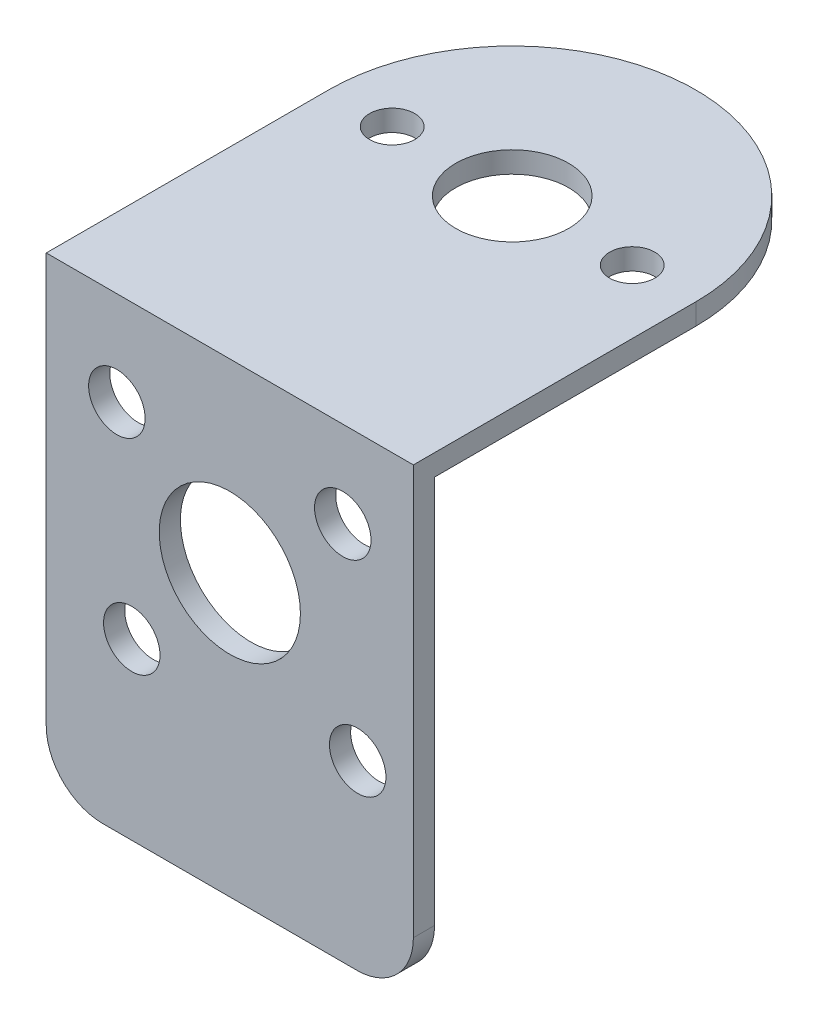
ISO-10303-21;
HEADER;
FILE_DESCRIPTION(('STEP AP214'),'2;1');
FILE_NAME('part.step','',(''),(''),'','','');
FILE_SCHEMA(('AUTOMOTIVE_DESIGN { 1 0 10303 214 1 1 1 1 }'));
ENDSEC;
DATA;
#1=APPLICATION_CONTEXT('core data for automotive mechanical design processes');
#2=APPLICATION_PROTOCOL_DEFINITION('international standard','automotive_design',2000,#1);
#3=PRODUCT_CONTEXT('',#1,'mechanical');
#4=PRODUCT('Part','Part','',(#3));
#5=PRODUCT_RELATED_PRODUCT_CATEGORY('part','',(#4));
#6=PRODUCT_DEFINITION_FORMATION('','',#4);
#7=PRODUCT_DEFINITION_CONTEXT('part definition',#1,'design');
#8=PRODUCT_DEFINITION('design','',#6,#7);
#9=PRODUCT_DEFINITION_SHAPE('','',#8);
#10=(LENGTH_UNIT() NAMED_UNIT(*) SI_UNIT(.MILLI.,.METRE.));
#11=(NAMED_UNIT(*) PLANE_ANGLE_UNIT() SI_UNIT($,.RADIAN.));
#12=(NAMED_UNIT(*) SI_UNIT($,.STERADIAN.) SOLID_ANGLE_UNIT());
#13=UNCERTAINTY_MEASURE_WITH_UNIT(LENGTH_MEASURE(1.E-05),#10,'distance_accuracy_value','');
#14=(GEOMETRIC_REPRESENTATION_CONTEXT(3) GLOBAL_UNCERTAINTY_ASSIGNED_CONTEXT((#13)) GLOBAL_UNIT_ASSIGNED_CONTEXT((#10,
#11,#12)) REPRESENTATION_CONTEXT('',''));
#15=CARTESIAN_POINT('',(0.,0.,0.));
#16=DIRECTION('',(0.,0.,1.));
#17=DIRECTION('',(1.,0.,0.));
#18=AXIS2_PLACEMENT_3D('',#15,#16,#17);
#19=CARTESIAN_POINT('',(-13.,-1.5,20.));
#20=DIRECTION('',(0.,0.,1.));
#21=DIRECTION('',(1.,0.,0.));
#22=AXIS2_PLACEMENT_3D('',#19,#20,#21);
#23=PLANE('',#22);
#24=DIRECTION('',(1.,0.,0.));
#25=VECTOR('',#24,1.);
#26=CARTESIAN_POINT('',(-13.,0.,20.));
#27=LINE('',#26,#25);
#28=CARTESIAN_POINT('',(-13.,0.,20.));
#29=VERTEX_POINT('',#28);
#30=CARTESIAN_POINT('',(13.,0.,20.));
#31=VERTEX_POINT('',#30);
#32=EDGE_CURVE('E87',#29,#31,#27,.T.);
#33=ORIENTED_EDGE('',*,*,#32,.F.);
#34=DIRECTION('',(0.,1.,0.));
#35=VECTOR('',#34,1.);
#36=CARTESIAN_POINT('',(-13.,-1.5,20.));
#37=LINE('',#36,#35);
#38=CARTESIAN_POINT('',(-13.,-29.,20.));
#39=VERTEX_POINT('',#38);
#40=EDGE_CURVE('E11',#39,#29,#37,.T.);
#41=ORIENTED_EDGE('',*,*,#40,.F.);
#42=CARTESIAN_POINT('',(-9.,-29.,20.));
#43=DIRECTION('',(0.,0.,1.));
#44=DIRECTION('',(1.,0.,0.));
#45=AXIS2_PLACEMENT_3D('',#42,#43,#44);
#46=CIRCLE('',#45,4.);
#47=CARTESIAN_POINT('',(-8.99999999999997,-33.,20.));
#48=VERTEX_POINT('',#47);
#49=EDGE_CURVE('E142',#39,#48,#46,.T.);
#50=ORIENTED_EDGE('',*,*,#49,.T.);
#51=DIRECTION('',(1.,0.,0.));
#52=VECTOR('',#51,1.);
#53=CARTESIAN_POINT('',(-8.99999999999997,-33.,20.));
#54=LINE('',#53,#52);
#55=CARTESIAN_POINT('',(8.99999999999997,-33.,20.));
#56=VERTEX_POINT('',#55);
#57=EDGE_CURVE('E138',#48,#56,#54,.T.);
#58=ORIENTED_EDGE('',*,*,#57,.T.);
#59=CARTESIAN_POINT('',(9.00000000000001,-29.,20.));
#60=DIRECTION('',(0.,0.,1.));
#61=DIRECTION('',(-1.,0.,0.));
#62=AXIS2_PLACEMENT_3D('',#59,#60,#61);
#63=CIRCLE('',#62,4.);
#64=CARTESIAN_POINT('',(13.,-29.,20.));
#65=VERTEX_POINT('',#64);
#66=EDGE_CURVE('E129',#56,#65,#63,.T.);
#67=ORIENTED_EDGE('',*,*,#66,.T.);
#68=DIRECTION('',(0.,1.,0.));
#69=VECTOR('',#68,1.);
#70=CARTESIAN_POINT('',(13.,-1.5,20.));
#71=LINE('',#70,#69);
#72=EDGE_CURVE('E38',#65,#31,#71,.T.);
#73=ORIENTED_EDGE('',*,*,#72,.T.);
#74=EDGE_LOOP('',(#33,#41,#50,#58,#67,#73));
#75=FACE_BOUND('',#74,.T.);
#76=CARTESIAN_POINT('',(9.05732469873245,-20.1222303547735,20.));
#77=DIRECTION('',(0.,0.,1.));
#78=DIRECTION('',(1.,0.,0.));
#79=AXIS2_PLACEMENT_3D('',#76,#77,#78);
#80=CIRCLE('',#79,2.);
#81=CARTESIAN_POINT('',(11.0573246987324,-20.1222303547735,20.));
#82=VERTEX_POINT('',#81);
#83=EDGE_CURVE('E371',#82,#82,#80,.T.);
#84=ORIENTED_EDGE('',*,*,#83,.F.);
#85=EDGE_LOOP('',(#84));
#86=FACE_BOUND('',#85,.T.);
#87=CARTESIAN_POINT('',(-6.94267530126755,-20.6476318564629,20.));
#88=DIRECTION('',(0.,0.,1.));
#89=DIRECTION('',(1.,0.,0.));
#90=AXIS2_PLACEMENT_3D('',#87,#88,#89);
#91=CIRCLE('',#90,2.);
#92=CARTESIAN_POINT('',(-4.94267530126755,-20.6476318564629,20.));
#93=VERTEX_POINT('',#92);
#94=EDGE_CURVE('E365',#93,#93,#91,.T.);
#95=ORIENTED_EDGE('',*,*,#94,.F.);
#96=EDGE_LOOP('',(#95));
#97=FACE_BOUND('',#96,.T.);
#98=CARTESIAN_POINT('',(-8.,-6.64763185646285,20.));
#99=DIRECTION('',(0.,0.,1.));
#100=DIRECTION('',(1.,0.,0.));
#101=AXIS2_PLACEMENT_3D('',#98,#99,#100);
#102=CIRCLE('',#101,2.);
#103=CARTESIAN_POINT('',(-6.,-6.64763185646285,20.));
#104=VERTEX_POINT('',#103);
#105=EDGE_CURVE('E359',#104,#104,#102,.T.);
#106=ORIENTED_EDGE('',*,*,#105,.F.);
#107=EDGE_LOOP('',(#106));
#108=FACE_BOUND('',#107,.T.);
#109=CARTESIAN_POINT('',(8.,-6.1222303547735,20.));
#110=DIRECTION('',(0.,0.,1.));
#111=DIRECTION('',(1.,0.,0.));
#112=AXIS2_PLACEMENT_3D('',#109,#110,#111);
#113=CIRCLE('',#112,2.);
#114=CARTESIAN_POINT('',(10.,-6.1222303547735,20.));
#115=VERTEX_POINT('',#114);
#116=EDGE_CURVE('E337',#115,#115,#113,.T.);
#117=ORIENTED_EDGE('',*,*,#116,.F.);
#118=EDGE_LOOP('',(#117));
#119=FACE_BOUND('',#118,.T.);
#120=CARTESIAN_POINT('',(0.,-13.1222303547735,20.));
#121=DIRECTION('',(0.,0.,1.));
#122=DIRECTION('',(1.,0.,0.));
#123=AXIS2_PLACEMENT_3D('',#120,#121,#122);
#124=CIRCLE('',#123,5.);
#125=CARTESIAN_POINT('',(5.,-13.1222303547735,20.));
#126=VERTEX_POINT('',#125);
#127=EDGE_CURVE('E329',#126,#126,#124,.T.);
#128=ORIENTED_EDGE('',*,*,#127,.F.);
#129=EDGE_LOOP('',(#128));
#130=FACE_BOUND('',#129,.T.);
#131=ADVANCED_FACE('F35',(#75,#86,#97,#108,#119,#130),#23,.T.);
#132=CARTESIAN_POINT('',(-13.,-1.5,20.));
#133=DIRECTION('',(-1.,0.,0.));
#134=DIRECTION('',(0.,0.,1.));
#135=AXIS2_PLACEMENT_3D('',#132,#133,#134);
#136=PLANE('',#135);
#137=DIRECTION('',(0.,0.,1.));
#138=VECTOR('',#137,1.);
#139=CARTESIAN_POINT('',(-13.,0.,20.));
#140=LINE('',#139,#138);
#141=CARTESIAN_POINT('',(-13.,0.,0.));
#142=VERTEX_POINT('',#141);
#143=EDGE_CURVE('E79',#142,#29,#140,.T.);
#144=ORIENTED_EDGE('',*,*,#143,.F.);
#145=DIRECTION('',(0.,1.,0.));
#146=VECTOR('',#145,1.);
#147=CARTESIAN_POINT('',(-13.,-1.5,0.));
#148=LINE('',#147,#146);
#149=CARTESIAN_POINT('',(-13.,-1.5,0.));
#150=VERTEX_POINT('',#149);
#151=EDGE_CURVE('E43',#150,#142,#148,.T.);
#152=ORIENTED_EDGE('',*,*,#151,.F.);
#153=DIRECTION('',(0.,0.,1.));
#154=VECTOR('',#153,1.);
#155=CARTESIAN_POINT('',(-13.,-1.5,20.));
#156=LINE('',#155,#154);
#157=CARTESIAN_POINT('',(-13.,-1.5,18.5));
#158=VERTEX_POINT('',#157);
#159=EDGE_CURVE('E111',#150,#158,#156,.T.);
#160=ORIENTED_EDGE('',*,*,#159,.T.);
#161=DIRECTION('',(0.,-1.,0.));
#162=VECTOR('',#161,1.);
#163=CARTESIAN_POINT('',(-13.,-1.5,18.5));
#164=LINE('',#163,#162);
#165=CARTESIAN_POINT('',(-13.,-29.,18.5));
#166=VERTEX_POINT('',#165);
#167=EDGE_CURVE('E51',#158,#166,#164,.T.);
#168=ORIENTED_EDGE('',*,*,#167,.T.);
#169=DIRECTION('',(0.,0.,1.));
#170=VECTOR('',#169,1.);
#171=CARTESIAN_POINT('',(-13.,-29.,18.5));
#172=LINE('',#171,#170);
#173=EDGE_CURVE('E82',#166,#39,#172,.T.);
#174=ORIENTED_EDGE('',*,*,#173,.T.);
#175=ORIENTED_EDGE('',*,*,#40,.T.);
#176=EDGE_LOOP('',(#144,#152,#160,#168,#174,#175));
#177=FACE_BOUND('',#176,.T.);
#178=ADVANCED_FACE('F77',(#177),#136,.T.);
#179=CARTESIAN_POINT('',(0.,-1.5,0.));
#180=DIRECTION('',(0.,1.,0.));
#181=DIRECTION('',(0.,0.,1.));
#182=AXIS2_PLACEMENT_3D('',#179,#180,#181);
#183=CYLINDRICAL_SURFACE('',#182,13.);
#184=CARTESIAN_POINT('',(0.,0.,0.));
#185=DIRECTION('',(0.,1.,0.));
#186=DIRECTION('',(0.,0.,1.));
#187=AXIS2_PLACEMENT_3D('',#184,#185,#186);
#188=CIRCLE('',#187,13.);
#189=CARTESIAN_POINT('',(13.,0.,0.));
#190=VERTEX_POINT('',#189);
#191=EDGE_CURVE('E100',#190,#142,#188,.T.);
#192=ORIENTED_EDGE('',*,*,#191,.F.);
#193=DIRECTION('',(0.,1.,0.));
#194=VECTOR('',#193,1.);
#195=CARTESIAN_POINT('',(13.,-1.5,0.));
#196=LINE('',#195,#194);
#197=CARTESIAN_POINT('',(13.,-1.5,0.));
#198=VERTEX_POINT('',#197);
#199=EDGE_CURVE('E108',#198,#190,#196,.T.);
#200=ORIENTED_EDGE('',*,*,#199,.F.);
#201=CARTESIAN_POINT('',(0.,-1.5,0.));
#202=DIRECTION('',(0.,1.,0.));
#203=DIRECTION('',(0.,0.,1.));
#204=AXIS2_PLACEMENT_3D('',#201,#202,#203);
#205=CIRCLE('',#204,13.);
#206=EDGE_CURVE('E103',#198,#150,#205,.T.);
#207=ORIENTED_EDGE('',*,*,#206,.T.);
#208=ORIENTED_EDGE('',*,*,#151,.T.);
#209=EDGE_LOOP('',(#192,#200,#207,#208));
#210=FACE_BOUND('',#209,.T.);
#211=ADVANCED_FACE('F192',(#210),#183,.T.);
#212=CARTESIAN_POINT('',(13.,-1.5,20.));
#213=DIRECTION('',(1.,0.,0.));
#214=DIRECTION('',(0.,0.,-1.));
#215=AXIS2_PLACEMENT_3D('',#212,#213,#214);
#216=PLANE('',#215);
#217=DIRECTION('',(0.,0.,-1.));
#218=VECTOR('',#217,1.);
#219=CARTESIAN_POINT('',(13.,0.,20.));
#220=LINE('',#219,#218);
#221=EDGE_CURVE('E94',#31,#190,#220,.T.);
#222=ORIENTED_EDGE('',*,*,#221,.F.);
#223=ORIENTED_EDGE('',*,*,#72,.F.);
#224=DIRECTION('',(0.,0.,1.));
#225=VECTOR('',#224,1.);
#226=CARTESIAN_POINT('',(13.,-29.,18.5));
#227=LINE('',#226,#225);
#228=CARTESIAN_POINT('',(13.,-29.,18.5));
#229=VERTEX_POINT('',#228);
#230=EDGE_CURVE('E121',#229,#65,#227,.T.);
#231=ORIENTED_EDGE('',*,*,#230,.F.);
#232=DIRECTION('',(0.,1.,0.));
#233=VECTOR('',#232,1.);
#234=CARTESIAN_POINT('',(13.,-1.5,18.5));
#235=LINE('',#234,#233);
#236=CARTESIAN_POINT('',(13.,-1.5,18.5));
#237=VERTEX_POINT('',#236);
#238=EDGE_CURVE('E152',#229,#237,#235,.T.);
#239=ORIENTED_EDGE('',*,*,#238,.T.);
#240=DIRECTION('',(0.,0.,-1.));
#241=VECTOR('',#240,1.);
#242=CARTESIAN_POINT('',(13.,-1.5,20.));
#243=LINE('',#242,#241);
#244=EDGE_CURVE('E101',#237,#198,#243,.T.);
#245=ORIENTED_EDGE('',*,*,#244,.T.);
#246=ORIENTED_EDGE('',*,*,#199,.T.);
#247=EDGE_LOOP('',(#222,#223,#231,#239,#245,#246));
#248=FACE_BOUND('',#247,.T.);
#249=ADVANCED_FACE('F115',(#248),#216,.T.);
#250=CARTESIAN_POINT('',(0.,-1.5,0.));
#251=DIRECTION('',(0.,1.,0.));
#252=DIRECTION('',(0.,0.,1.));
#253=AXIS2_PLACEMENT_3D('',#250,#251,#252);
#254=PLANE('',#253);
#255=CARTESIAN_POINT('',(-8.5,-1.5,0.));
#256=DIRECTION('',(0.,1.,0.));
#257=DIRECTION('',(0.,0.,1.));
#258=AXIS2_PLACEMENT_3D('',#255,#256,#257);
#259=CIRCLE('',#258,1.6);
#260=CARTESIAN_POINT('',(-8.5,-1.5,1.6));
#261=VERTEX_POINT('',#260);
#262=EDGE_CURVE('E153',#261,#261,#259,.T.);
#263=ORIENTED_EDGE('',*,*,#262,.T.);
#264=EDGE_LOOP('',(#263));
#265=FACE_BOUND('',#264,.T.);
#266=CARTESIAN_POINT('',(8.5,-1.5,0.));
#267=DIRECTION('',(0.,1.,0.));
#268=DIRECTION('',(0.,0.,1.));
#269=AXIS2_PLACEMENT_3D('',#266,#267,#268);
#270=CIRCLE('',#269,1.6);
#271=CARTESIAN_POINT('',(8.5,-1.5,1.6));
#272=VERTEX_POINT('',#271);
#273=EDGE_CURVE('E159',#272,#272,#270,.T.);
#274=ORIENTED_EDGE('',*,*,#273,.T.);
#275=EDGE_LOOP('',(#274));
#276=FACE_BOUND('',#275,.T.);
#277=CARTESIAN_POINT('',(0.,-1.5,0.));
#278=DIRECTION('',(0.,1.,0.));
#279=DIRECTION('',(0.,0.,1.));
#280=AXIS2_PLACEMENT_3D('',#277,#278,#279);
#281=CIRCLE('',#280,4.);
#282=CARTESIAN_POINT('',(0.,-1.5,4.));
#283=VERTEX_POINT('',#282);
#284=EDGE_CURVE('E95',#283,#283,#281,.T.);
#285=ORIENTED_EDGE('',*,*,#284,.T.);
#286=EDGE_LOOP('',(#285));
#287=FACE_BOUND('',#286,.T.);
#288=ORIENTED_EDGE('',*,*,#244,.F.);
#289=DIRECTION('',(-1.,0.,0.));
#290=VECTOR('',#289,1.);
#291=CARTESIAN_POINT('',(-13.,-1.5,18.5));
#292=LINE('',#291,#290);
#293=EDGE_CURVE('E139',#237,#158,#292,.T.);
#294=ORIENTED_EDGE('',*,*,#293,.T.);
#295=ORIENTED_EDGE('',*,*,#159,.F.);
#296=ORIENTED_EDGE('',*,*,#206,.F.);
#297=EDGE_LOOP('',(#288,#294,#295,#296));
#298=FACE_BOUND('',#297,.T.);
#299=ADVANCED_FACE('F173',(#265,#276,#287,#298),#254,.F.);
#300=CARTESIAN_POINT('',(0.,0.,0.));
#301=DIRECTION('',(0.,1.,0.));
#302=DIRECTION('',(0.,0.,1.));
#303=AXIS2_PLACEMENT_3D('',#300,#301,#302);
#304=PLANE('',#303);
#305=CARTESIAN_POINT('',(-8.5,0.,0.));
#306=DIRECTION('',(0.,1.,0.));
#307=DIRECTION('',(0.,0.,1.));
#308=AXIS2_PLACEMENT_3D('',#305,#306,#307);
#309=CIRCLE('',#308,1.6);
#310=CARTESIAN_POINT('',(-8.5,0.,1.6));
#311=VERTEX_POINT('',#310);
#312=EDGE_CURVE('E134',#311,#311,#309,.T.);
#313=ORIENTED_EDGE('',*,*,#312,.F.);
#314=EDGE_LOOP('',(#313));
#315=FACE_BOUND('',#314,.T.);
#316=CARTESIAN_POINT('',(8.5,0.,0.));
#317=DIRECTION('',(0.,1.,0.));
#318=DIRECTION('',(0.,0.,1.));
#319=AXIS2_PLACEMENT_3D('',#316,#317,#318);
#320=CIRCLE('',#319,1.6);
#321=CARTESIAN_POINT('',(8.5,0.,1.6));
#322=VERTEX_POINT('',#321);
#323=EDGE_CURVE('E156',#322,#322,#320,.T.);
#324=ORIENTED_EDGE('',*,*,#323,.F.);
#325=EDGE_LOOP('',(#324));
#326=FACE_BOUND('',#325,.T.);
#327=CARTESIAN_POINT('',(0.,0.,0.));
#328=DIRECTION('',(0.,1.,0.));
#329=DIRECTION('',(0.,0.,1.));
#330=AXIS2_PLACEMENT_3D('',#327,#328,#329);
#331=CIRCLE('',#330,4.);
#332=CARTESIAN_POINT('',(0.,0.,4.));
#333=VERTEX_POINT('',#332);
#334=EDGE_CURVE('E162',#333,#333,#331,.T.);
#335=ORIENTED_EDGE('',*,*,#334,.F.);
#336=EDGE_LOOP('',(#335));
#337=FACE_BOUND('',#336,.T.);
#338=ORIENTED_EDGE('',*,*,#32,.T.);
#339=ORIENTED_EDGE('',*,*,#221,.T.);
#340=ORIENTED_EDGE('',*,*,#191,.T.);
#341=ORIENTED_EDGE('',*,*,#143,.T.);
#342=EDGE_LOOP('',(#338,#339,#340,#341));
#343=FACE_BOUND('',#342,.T.);
#344=ADVANCED_FACE('F98',(#315,#326,#337,#343),#304,.T.);
#345=CARTESIAN_POINT('',(0.,-1.5,0.));
#346=DIRECTION('',(0.,1.,0.));
#347=DIRECTION('',(0.,0.,1.));
#348=AXIS2_PLACEMENT_3D('',#345,#346,#347);
#349=CYLINDRICAL_SURFACE('',#348,4.);
#350=ORIENTED_EDGE('',*,*,#284,.F.);
#351=EDGE_LOOP('',(#350));
#352=FACE_BOUND('',#351,.T.);
#353=ORIENTED_EDGE('',*,*,#334,.T.);
#354=EDGE_LOOP('',(#353));
#355=FACE_BOUND('',#354,.T.);
#356=ADVANCED_FACE('F170',(#352,#355),#349,.F.);
#357=CARTESIAN_POINT('',(8.5,-1.5,0.));
#358=DIRECTION('',(0.,1.,0.));
#359=DIRECTION('',(0.,0.,1.));
#360=AXIS2_PLACEMENT_3D('',#357,#358,#359);
#361=CYLINDRICAL_SURFACE('',#360,1.6);
#362=ORIENTED_EDGE('',*,*,#273,.F.);
#363=EDGE_LOOP('',(#362));
#364=FACE_BOUND('',#363,.T.);
#365=ORIENTED_EDGE('',*,*,#323,.T.);
#366=EDGE_LOOP('',(#365));
#367=FACE_BOUND('',#366,.T.);
#368=ADVANCED_FACE('F180',(#364,#367),#361,.F.);
#369=CARTESIAN_POINT('',(-8.5,-1.5,0.));
#370=DIRECTION('',(0.,1.,0.));
#371=DIRECTION('',(0.,0.,1.));
#372=AXIS2_PLACEMENT_3D('',#369,#370,#371);
#373=CYLINDRICAL_SURFACE('',#372,1.6);
#374=ORIENTED_EDGE('',*,*,#262,.F.);
#375=EDGE_LOOP('',(#374));
#376=FACE_BOUND('',#375,.T.);
#377=ORIENTED_EDGE('',*,*,#312,.T.);
#378=EDGE_LOOP('',(#377));
#379=FACE_BOUND('',#378,.T.);
#380=ADVANCED_FACE('F219',(#376,#379),#373,.F.);
#381=CARTESIAN_POINT('',(9.00000000000001,-29.,18.5));
#382=DIRECTION('',(0.,0.,1.));
#383=DIRECTION('',(1.,0.,0.));
#384=AXIS2_PLACEMENT_3D('',#381,#382,#383);
#385=CYLINDRICAL_SURFACE('',#384,4.);
#386=ORIENTED_EDGE('',*,*,#66,.F.);
#387=DIRECTION('',(0.,0.,1.));
#388=VECTOR('',#387,1.);
#389=CARTESIAN_POINT('',(8.99999999999997,-33.,18.5));
#390=LINE('',#389,#388);
#391=CARTESIAN_POINT('',(8.99999999999997,-33.,18.5));
#392=VERTEX_POINT('',#391);
#393=EDGE_CURVE('E135',#392,#56,#390,.T.);
#394=ORIENTED_EDGE('',*,*,#393,.F.);
#395=CARTESIAN_POINT('',(9.00000000000001,-29.,18.5));
#396=DIRECTION('',(0.,0.,1.));
#397=DIRECTION('',(-1.,0.,0.));
#398=AXIS2_PLACEMENT_3D('',#395,#396,#397);
#399=CIRCLE('',#398,4.);
#400=EDGE_CURVE('E132',#392,#229,#399,.T.);
#401=ORIENTED_EDGE('',*,*,#400,.T.);
#402=ORIENTED_EDGE('',*,*,#230,.T.);
#403=EDGE_LOOP('',(#386,#394,#401,#402));
#404=FACE_BOUND('',#403,.T.);
#405=ADVANCED_FACE('F127',(#404),#385,.T.);
#406=CARTESIAN_POINT('',(-8.99999999999997,-33.,18.5));
#407=DIRECTION('',(0.,-1.,0.));
#408=DIRECTION('',(0.,0.,-1.));
#409=AXIS2_PLACEMENT_3D('',#406,#407,#408);
#410=PLANE('',#409);
#411=ORIENTED_EDGE('',*,*,#57,.F.);
#412=DIRECTION('',(0.,0.,1.));
#413=VECTOR('',#412,1.);
#414=CARTESIAN_POINT('',(-8.99999999999997,-33.,18.5));
#415=LINE('',#414,#413);
#416=CARTESIAN_POINT('',(-8.99999999999997,-33.,18.5));
#417=VERTEX_POINT('',#416);
#418=EDGE_CURVE('E148',#417,#48,#415,.T.);
#419=ORIENTED_EDGE('',*,*,#418,.F.);
#420=DIRECTION('',(1.,0.,0.));
#421=VECTOR('',#420,1.);
#422=CARTESIAN_POINT('',(-8.99999999999997,-33.,18.5));
#423=LINE('',#422,#421);
#424=EDGE_CURVE('E323',#417,#392,#423,.T.);
#425=ORIENTED_EDGE('',*,*,#424,.T.);
#426=ORIENTED_EDGE('',*,*,#393,.T.);
#427=EDGE_LOOP('',(#411,#419,#425,#426));
#428=FACE_BOUND('',#427,.T.);
#429=ADVANCED_FACE('F218',(#428),#410,.T.);
#430=CARTESIAN_POINT('',(-9.,-29.,18.5));
#431=DIRECTION('',(0.,0.,1.));
#432=DIRECTION('',(1.,0.,0.));
#433=AXIS2_PLACEMENT_3D('',#430,#431,#432);
#434=CYLINDRICAL_SURFACE('',#433,4.);
#435=ORIENTED_EDGE('',*,*,#49,.F.);
#436=ORIENTED_EDGE('',*,*,#173,.F.);
#437=CARTESIAN_POINT('',(-9.,-29.,18.5));
#438=DIRECTION('',(0.,0.,1.));
#439=DIRECTION('',(1.,0.,0.));
#440=AXIS2_PLACEMENT_3D('',#437,#438,#439);
#441=CIRCLE('',#440,4.);
#442=EDGE_CURVE('E341',#166,#417,#441,.T.);
#443=ORIENTED_EDGE('',*,*,#442,.T.);
#444=ORIENTED_EDGE('',*,*,#418,.T.);
#445=EDGE_LOOP('',(#435,#436,#443,#444));
#446=FACE_BOUND('',#445,.T.);
#447=ADVANCED_FACE('F229',(#446),#434,.T.);
#448=CARTESIAN_POINT('',(9.00000000000001,-29.,18.5));
#449=DIRECTION('',(0.,0.,-1.));
#450=DIRECTION('',(-1.,0.,0.));
#451=AXIS2_PLACEMENT_3D('',#448,#449,#450);
#452=PLANE('',#451);
#453=CARTESIAN_POINT('',(9.05732469873245,-20.1222303547735,18.5));
#454=DIRECTION('',(0.,0.,1.));
#455=DIRECTION('',(1.,0.,0.));
#456=AXIS2_PLACEMENT_3D('',#453,#454,#455);
#457=CIRCLE('',#456,2.);
#458=CARTESIAN_POINT('',(11.0573246987324,-20.1222303547735,18.5));
#459=VERTEX_POINT('',#458);
#460=EDGE_CURVE('E368',#459,#459,#457,.T.);
#461=ORIENTED_EDGE('',*,*,#460,.T.);
#462=EDGE_LOOP('',(#461));
#463=FACE_BOUND('',#462,.T.);
#464=CARTESIAN_POINT('',(-6.94267530126755,-20.6476318564629,18.5));
#465=DIRECTION('',(0.,0.,1.));
#466=DIRECTION('',(1.,0.,0.));
#467=AXIS2_PLACEMENT_3D('',#464,#465,#466);
#468=CIRCLE('',#467,2.);
#469=CARTESIAN_POINT('',(-4.94267530126755,-20.6476318564629,18.5));
#470=VERTEX_POINT('',#469);
#471=EDGE_CURVE('E362',#470,#470,#468,.T.);
#472=ORIENTED_EDGE('',*,*,#471,.T.);
#473=EDGE_LOOP('',(#472));
#474=FACE_BOUND('',#473,.T.);
#475=CARTESIAN_POINT('',(-8.,-6.64763185646285,18.5));
#476=DIRECTION('',(0.,0.,1.));
#477=DIRECTION('',(1.,0.,0.));
#478=AXIS2_PLACEMENT_3D('',#475,#476,#477);
#479=CIRCLE('',#478,2.);
#480=CARTESIAN_POINT('',(-6.,-6.64763185646285,18.5));
#481=VERTEX_POINT('',#480);
#482=EDGE_CURVE('E356',#481,#481,#479,.T.);
#483=ORIENTED_EDGE('',*,*,#482,.T.);
#484=EDGE_LOOP('',(#483));
#485=FACE_BOUND('',#484,.T.);
#486=CARTESIAN_POINT('',(8.,-6.1222303547735,18.5));
#487=DIRECTION('',(0.,0.,1.));
#488=DIRECTION('',(1.,0.,0.));
#489=AXIS2_PLACEMENT_3D('',#486,#487,#488);
#490=CIRCLE('',#489,2.);
#491=CARTESIAN_POINT('',(10.,-6.1222303547735,18.5));
#492=VERTEX_POINT('',#491);
#493=EDGE_CURVE('E334',#492,#492,#490,.T.);
#494=ORIENTED_EDGE('',*,*,#493,.T.);
#495=EDGE_LOOP('',(#494));
#496=FACE_BOUND('',#495,.T.);
#497=CARTESIAN_POINT('',(0.,-13.1222303547735,18.5));
#498=DIRECTION('',(0.,0.,1.));
#499=DIRECTION('',(1.,0.,0.));
#500=AXIS2_PLACEMENT_3D('',#497,#498,#499);
#501=CIRCLE('',#500,5.);
#502=CARTESIAN_POINT('',(5.,-13.1222303547735,18.5));
#503=VERTEX_POINT('',#502);
#504=EDGE_CURVE('E326',#503,#503,#501,.T.);
#505=ORIENTED_EDGE('',*,*,#504,.T.);
#506=EDGE_LOOP('',(#505));
#507=FACE_BOUND('',#506,.T.);
#508=ORIENTED_EDGE('',*,*,#293,.F.);
#509=ORIENTED_EDGE('',*,*,#238,.F.);
#510=ORIENTED_EDGE('',*,*,#400,.F.);
#511=ORIENTED_EDGE('',*,*,#424,.F.);
#512=ORIENTED_EDGE('',*,*,#442,.F.);
#513=ORIENTED_EDGE('',*,*,#167,.F.);
#514=EDGE_LOOP('',(#508,#509,#510,#511,#512,#513));
#515=FACE_BOUND('',#514,.T.);
#516=ADVANCED_FACE('F239',(#463,#474,#485,#496,#507,#515),#452,.T.);
#517=CARTESIAN_POINT('',(0.,-13.1222303547735,18.5));
#518=DIRECTION('',(0.,0.,1.));
#519=DIRECTION('',(1.,0.,0.));
#520=AXIS2_PLACEMENT_3D('',#517,#518,#519);
#521=CYLINDRICAL_SURFACE('',#520,5.);
#522=ORIENTED_EDGE('',*,*,#504,.F.);
#523=EDGE_LOOP('',(#522));
#524=FACE_BOUND('',#523,.T.);
#525=ORIENTED_EDGE('',*,*,#127,.T.);
#526=EDGE_LOOP('',(#525));
#527=FACE_BOUND('',#526,.T.);
#528=ADVANCED_FACE('F249',(#524,#527),#521,.F.);
#529=CARTESIAN_POINT('',(8.,-6.1222303547735,18.5));
#530=DIRECTION('',(0.,0.,1.));
#531=DIRECTION('',(1.,0.,0.));
#532=AXIS2_PLACEMENT_3D('',#529,#530,#531);
#533=CYLINDRICAL_SURFACE('',#532,2.);
#534=ORIENTED_EDGE('',*,*,#493,.F.);
#535=EDGE_LOOP('',(#534));
#536=FACE_BOUND('',#535,.T.);
#537=ORIENTED_EDGE('',*,*,#116,.T.);
#538=EDGE_LOOP('',(#537));
#539=FACE_BOUND('',#538,.T.);
#540=ADVANCED_FACE('F259',(#536,#539),#533,.F.);
#541=CARTESIAN_POINT('',(-8.,-6.64763185646285,18.5));
#542=DIRECTION('',(0.,0.,1.));
#543=DIRECTION('',(1.,0.,0.));
#544=AXIS2_PLACEMENT_3D('',#541,#542,#543);
#545=CYLINDRICAL_SURFACE('',#544,2.);
#546=ORIENTED_EDGE('',*,*,#482,.F.);
#547=EDGE_LOOP('',(#546));
#548=FACE_BOUND('',#547,.T.);
#549=ORIENTED_EDGE('',*,*,#105,.T.);
#550=EDGE_LOOP('',(#549));
#551=FACE_BOUND('',#550,.T.);
#552=ADVANCED_FACE('F269',(#548,#551),#545,.F.);
#553=CARTESIAN_POINT('',(-6.94267530126755,-20.6476318564629,18.5));
#554=DIRECTION('',(0.,0.,1.));
#555=DIRECTION('',(1.,0.,0.));
#556=AXIS2_PLACEMENT_3D('',#553,#554,#555);
#557=CYLINDRICAL_SURFACE('',#556,2.);
#558=ORIENTED_EDGE('',*,*,#471,.F.);
#559=EDGE_LOOP('',(#558));
#560=FACE_BOUND('',#559,.T.);
#561=ORIENTED_EDGE('',*,*,#94,.T.);
#562=EDGE_LOOP('',(#561));
#563=FACE_BOUND('',#562,.T.);
#564=ADVANCED_FACE('F279',(#560,#563),#557,.F.);
#565=CARTESIAN_POINT('',(9.05732469873245,-20.1222303547735,18.5));
#566=DIRECTION('',(0.,0.,1.));
#567=DIRECTION('',(1.,0.,0.));
#568=AXIS2_PLACEMENT_3D('',#565,#566,#567);
#569=CYLINDRICAL_SURFACE('',#568,2.);
#570=ORIENTED_EDGE('',*,*,#460,.F.);
#571=EDGE_LOOP('',(#570));
#572=FACE_BOUND('',#571,.T.);
#573=ORIENTED_EDGE('',*,*,#83,.T.);
#574=EDGE_LOOP('',(#573));
#575=FACE_BOUND('',#574,.T.);
#576=ADVANCED_FACE('F289',(#572,#575),#569,.F.);
#577=CLOSED_SHELL('',(#131,#178,#211,#249,#299,#344,#356,#368,#380,#405,#429,#447,#516,#528,
#540,#552,#564,#576));
#578=MANIFOLD_SOLID_BREP('B2',#577);
#579=ADVANCED_BREP_SHAPE_REPRESENTATION('',(#18,#578),#14);
#580=SHAPE_DEFINITION_REPRESENTATION(#9,#579);
ENDSEC;
END-ISO-10303-21;
